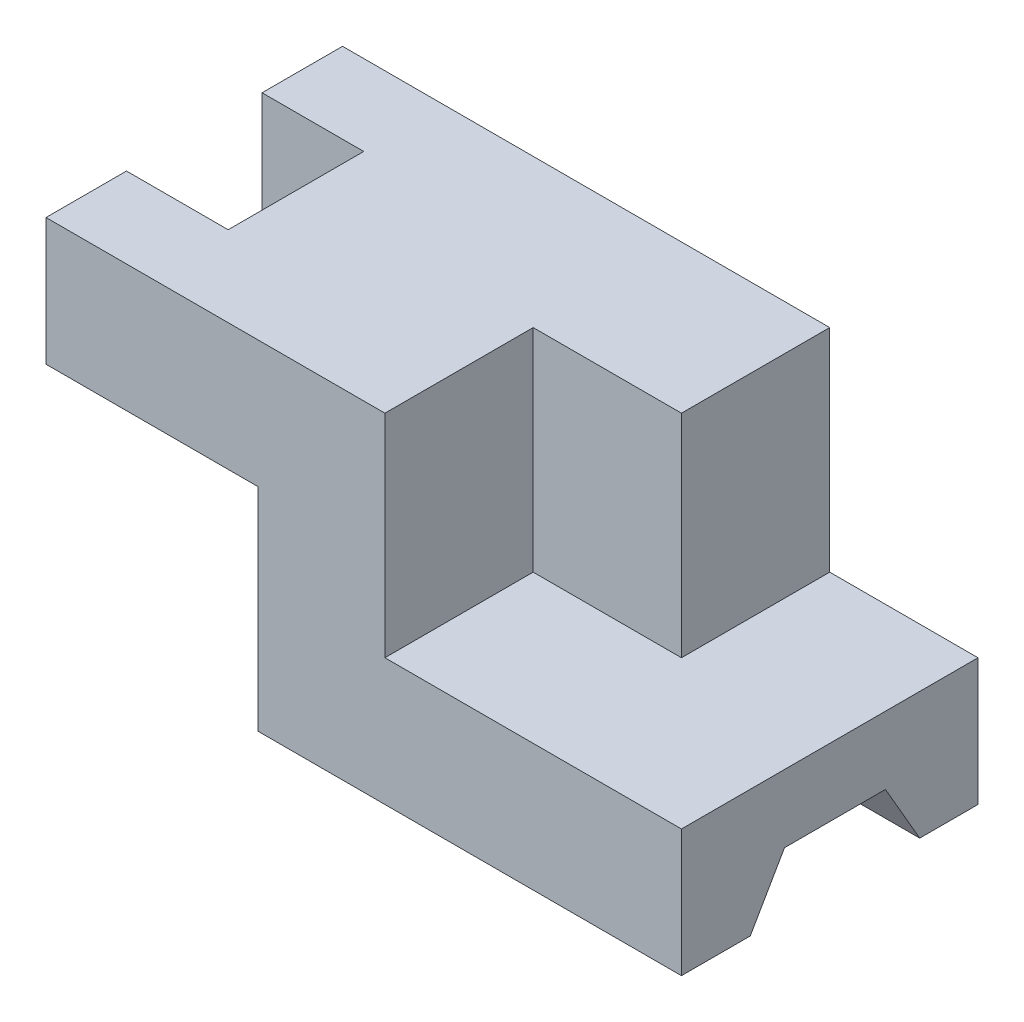
ISO-10303-21;
HEADER;
FILE_DESCRIPTION(('STEP AP214'),'2;1');
FILE_NAME('part.step','',(''),(''),'','','');
FILE_SCHEMA(('AUTOMOTIVE_DESIGN { 1 0 10303 214 1 1 1 1 }'));
ENDSEC;
DATA;
#1=APPLICATION_CONTEXT('core data for automotive mechanical design processes');
#2=APPLICATION_PROTOCOL_DEFINITION('international standard','automotive_design',2000,#1);
#3=PRODUCT_CONTEXT('',#1,'mechanical');
#4=PRODUCT('Part','Part','',(#3));
#5=PRODUCT_RELATED_PRODUCT_CATEGORY('part','',(#4));
#6=PRODUCT_DEFINITION_FORMATION('','',#4);
#7=PRODUCT_DEFINITION_CONTEXT('part definition',#1,'design');
#8=PRODUCT_DEFINITION('design','',#6,#7);
#9=PRODUCT_DEFINITION_SHAPE('','',#8);
#10=(LENGTH_UNIT() NAMED_UNIT(*) SI_UNIT(.MILLI.,.METRE.));
#11=(NAMED_UNIT(*) PLANE_ANGLE_UNIT() SI_UNIT($,.RADIAN.));
#12=(NAMED_UNIT(*) SI_UNIT($,.STERADIAN.) SOLID_ANGLE_UNIT());
#13=UNCERTAINTY_MEASURE_WITH_UNIT(LENGTH_MEASURE(1.E-05),#10,'distance_accuracy_value','');
#14=(GEOMETRIC_REPRESENTATION_CONTEXT(3) GLOBAL_UNCERTAINTY_ASSIGNED_CONTEXT((#13)) GLOBAL_UNIT_ASSIGNED_CONTEXT((#10,
#11,#12)) REPRESENTATION_CONTEXT('',''));
#15=CARTESIAN_POINT('',(0.,0.,0.));
#16=DIRECTION('',(0.,0.,1.));
#17=DIRECTION('',(1.,0.,0.));
#18=AXIS2_PLACEMENT_3D('',#15,#16,#17);
#19=CARTESIAN_POINT('',(25.,0.,35.));
#20=DIRECTION('',(-1.,0.,0.));
#21=DIRECTION('',(0.,0.,1.));
#22=AXIS2_PLACEMENT_3D('',#19,#20,#21);
#23=PLANE('',#22);
#24=DIRECTION('',(0.,0.,1.));
#25=VECTOR('',#24,1.);
#26=CARTESIAN_POINT('',(25.,7.,35.));
#27=LINE('',#26,#25);
#28=CARTESIAN_POINT('',(25.,7.,10.9203967015316));
#29=VERTEX_POINT('',#28);
#30=CARTESIAN_POINT('',(25.,7.,22.8374929328767));
#31=VERTEX_POINT('',#30);
#32=EDGE_CURVE('E347',#29,#31,#27,.T.);
#33=ORIENTED_EDGE('',*,*,#32,.T.);
#34=DIRECTION('',(0.,-0.866025403784436,0.500000000000004));
#35=VECTOR('',#34,1.);
#36=CARTESIAN_POINT('',(25.,-3.51652004691827,28.9092086129031));
#37=LINE('',#36,#35);
#38=CARTESIAN_POINT('',(25.,0.,26.8789448172041));
#39=VERTEX_POINT('',#38);
#40=EDGE_CURVE('E345',#31,#39,#37,.T.);
#41=ORIENTED_EDGE('',*,*,#40,.T.);
#42=DIRECTION('',(0.,0.,-1.));
#43=VECTOR('',#42,1.);
#44=CARTESIAN_POINT('',(25.,0.,35.));
#45=LINE('',#44,#43);
#46=CARTESIAN_POINT('',(25.,0.,35.));
#47=VERTEX_POINT('',#46);
#48=EDGE_CURVE('E185',#47,#39,#45,.T.);
#49=ORIENTED_EDGE('',*,*,#48,.F.);
#50=DIRECTION('',(0.,1.,0.));
#51=VECTOR('',#50,1.);
#52=CARTESIAN_POINT('',(25.,0.,35.));
#53=LINE('',#52,#51);
#54=CARTESIAN_POINT('',(25.,25.,35.));
#55=VERTEX_POINT('',#54);
#56=EDGE_CURVE('E276',#47,#55,#53,.T.);
#57=ORIENTED_EDGE('',*,*,#56,.T.);
#58=DIRECTION('',(0.,0.,-1.));
#59=VECTOR('',#58,1.);
#60=CARTESIAN_POINT('',(25.,25.,35.));
#61=LINE('',#60,#59);
#62=CARTESIAN_POINT('',(25.,25.,0.));
#63=VERTEX_POINT('',#62);
#64=EDGE_CURVE('E204',#55,#63,#61,.T.);
#65=ORIENTED_EDGE('',*,*,#64,.T.);
#66=DIRECTION('',(0.,1.,0.));
#67=VECTOR('',#66,1.);
#68=CARTESIAN_POINT('',(25.,0.,0.));
#69=LINE('',#68,#67);
#70=CARTESIAN_POINT('',(25.,0.,0.));
#71=VERTEX_POINT('',#70);
#72=EDGE_CURVE('E300',#71,#63,#69,.T.);
#73=ORIENTED_EDGE('',*,*,#72,.F.);
#74=CARTESIAN_POINT('',(25.,0.,6.87894481720414));
#75=VERTEX_POINT('',#74);
#76=EDGE_CURVE('E193',#75,#71,#45,.T.);
#77=ORIENTED_EDGE('',*,*,#76,.F.);
#78=DIRECTION('',(0.,0.866025403784436,0.500000000000004));
#79=VECTOR('',#78,1.);
#80=CARTESIAN_POINT('',(25.,12.1767740847627,13.9092086129032));
#81=LINE('',#80,#79);
#82=EDGE_CURVE('E187',#75,#29,#81,.T.);
#83=ORIENTED_EDGE('',*,*,#82,.T.);
#84=EDGE_LOOP('',(#33,#41,#49,#57,#65,#73,#77,#83));
#85=FACE_BOUND('',#84,.T.);
#86=ADVANCED_FACE('F39',(#85),#23,.T.);
#87=CARTESIAN_POINT('',(0.,0.,35.));
#88=DIRECTION('',(0.,1.,0.));
#89=DIRECTION('',(0.,0.,1.));
#90=AXIS2_PLACEMENT_3D('',#87,#88,#89);
#91=PLANE('',#90);
#92=DIRECTION('',(1.,0.,0.));
#93=VECTOR('',#92,1.);
#94=CARTESIAN_POINT('',(0.,0.,26.8789448172041));
#95=LINE('',#94,#93);
#96=CARTESIAN_POINT('',(75.,0.,26.8789448172041));
#97=VERTEX_POINT('',#96);
#98=EDGE_CURVE('E167',#39,#97,#95,.T.);
#99=ORIENTED_EDGE('',*,*,#98,.T.);
#100=DIRECTION('',(0.,0.,-1.));
#101=VECTOR('',#100,1.);
#102=CARTESIAN_POINT('',(75.,0.,35.));
#103=LINE('',#102,#101);
#104=CARTESIAN_POINT('',(75.,0.,35.));
#105=VERTEX_POINT('',#104);
#106=EDGE_CURVE('E183',#105,#97,#103,.T.);
#107=ORIENTED_EDGE('',*,*,#106,.F.);
#108=DIRECTION('',(1.,0.,0.));
#109=VECTOR('',#108,1.);
#110=CARTESIAN_POINT('',(0.,0.,35.));
#111=LINE('',#110,#109);
#112=EDGE_CURVE('E280',#47,#105,#111,.T.);
#113=ORIENTED_EDGE('',*,*,#112,.F.);
#114=ORIENTED_EDGE('',*,*,#48,.T.);
#115=EDGE_LOOP('',(#99,#107,#113,#114));
#116=FACE_BOUND('',#115,.T.);
#117=ADVANCED_FACE('F181',(#116),#91,.F.);
#118=DIRECTION('',(1.,0.,0.));
#119=VECTOR('',#118,1.);
#120=CARTESIAN_POINT('',(0.,0.,6.87894481720414));
#121=LINE('',#120,#119);
#122=CARTESIAN_POINT('',(75.,0.,6.87894481720414));
#123=VERTEX_POINT('',#122);
#124=EDGE_CURVE('E55',#75,#123,#121,.T.);
#125=ORIENTED_EDGE('',*,*,#124,.F.);
#126=ORIENTED_EDGE('',*,*,#76,.T.);
#127=DIRECTION('',(1.,0.,0.));
#128=VECTOR('',#127,1.);
#129=CARTESIAN_POINT('',(0.,0.,0.));
#130=LINE('',#129,#128);
#131=CARTESIAN_POINT('',(75.,0.,0.));
#132=VERTEX_POINT('',#131);
#133=EDGE_CURVE('E304',#71,#132,#130,.T.);
#134=ORIENTED_EDGE('',*,*,#133,.T.);
#135=EDGE_CURVE('E194',#123,#132,#103,.T.);
#136=ORIENTED_EDGE('',*,*,#135,.F.);
#137=EDGE_LOOP('',(#125,#126,#134,#136));
#138=FACE_BOUND('',#137,.T.);
#139=ADVANCED_FACE('F404',(#138),#91,.F.);
#140=CARTESIAN_POINT('',(75.,0.,35.));
#141=DIRECTION('',(-1.,0.,0.));
#142=DIRECTION('',(0.,0.,1.));
#143=AXIS2_PLACEMENT_3D('',#140,#141,#142);
#144=PLANE('',#143);
#145=DIRECTION('',(0.,0.866025403784436,-0.500000000000004));
#146=VECTOR('',#145,1.);
#147=CARTESIAN_POINT('',(75.,0.,26.8789448172041));
#148=LINE('',#147,#146);
#149=CARTESIAN_POINT('',(75.,7.,22.8374929328767));
#150=VERTEX_POINT('',#149);
#151=EDGE_CURVE('E164',#97,#150,#148,.T.);
#152=ORIENTED_EDGE('',*,*,#151,.T.);
#153=DIRECTION('',(0.,0.,-1.));
#154=VECTOR('',#153,1.);
#155=CARTESIAN_POINT('',(75.,7.,22.8374929328767));
#156=LINE('',#155,#154);
#157=CARTESIAN_POINT('',(75.,7.,10.9203967015316));
#158=VERTEX_POINT('',#157);
#159=EDGE_CURVE('E176',#150,#158,#156,.T.);
#160=ORIENTED_EDGE('',*,*,#159,.T.);
#161=DIRECTION('',(0.,-0.866025403784436,-0.500000000000004));
#162=VECTOR('',#161,1.);
#163=CARTESIAN_POINT('',(75.,7.,10.9203967015316));
#164=LINE('',#163,#162);
#165=EDGE_CURVE('E556',#158,#123,#164,.T.);
#166=ORIENTED_EDGE('',*,*,#165,.T.);
#167=ORIENTED_EDGE('',*,*,#135,.T.);
#168=DIRECTION('',(0.,1.,0.));
#169=VECTOR('',#168,1.);
#170=CARTESIAN_POINT('',(75.,0.,0.));
#171=LINE('',#170,#169);
#172=CARTESIAN_POINT('',(75.,15.,0.));
#173=VERTEX_POINT('',#172);
#174=EDGE_CURVE('E262',#132,#173,#171,.T.);
#175=ORIENTED_EDGE('',*,*,#174,.T.);
#176=DIRECTION('',(0.,0.,-1.));
#177=VECTOR('',#176,1.);
#178=CARTESIAN_POINT('',(75.,15.,35.));
#179=LINE('',#178,#177);
#180=CARTESIAN_POINT('',(75.,15.,35.));
#181=VERTEX_POINT('',#180);
#182=EDGE_CURVE('E199',#181,#173,#179,.T.);
#183=ORIENTED_EDGE('',*,*,#182,.F.);
#184=DIRECTION('',(0.,1.,0.));
#185=VECTOR('',#184,1.);
#186=CARTESIAN_POINT('',(75.,0.,35.));
#187=LINE('',#186,#185);
#188=EDGE_CURVE('E191',#105,#181,#187,.T.);
#189=ORIENTED_EDGE('',*,*,#188,.F.);
#190=ORIENTED_EDGE('',*,*,#106,.T.);
#191=EDGE_LOOP('',(#152,#160,#166,#167,#175,#183,#189,#190));
#192=FACE_BOUND('',#191,.T.);
#193=ADVANCED_FACE('F189',(#192),#144,.F.);
#194=CARTESIAN_POINT('',(0.,40.,35.));
#195=DIRECTION('',(0.,1.,0.));
#196=DIRECTION('',(0.,0.,1.));
#197=AXIS2_PLACEMENT_3D('',#194,#195,#196);
#198=PLANE('',#197);
#199=DIRECTION('',(0.,0.,-1.));
#200=VECTOR('',#199,1.);
#201=CARTESIAN_POINT('',(0.,40.,35.));
#202=LINE('',#201,#200);
#203=CARTESIAN_POINT('',(0.,40.,9.5));
#204=VERTEX_POINT('',#203);
#205=CARTESIAN_POINT('',(0.,40.,0.));
#206=VERTEX_POINT('',#205);
#207=EDGE_CURVE('E212',#204,#206,#202,.T.);
#208=ORIENTED_EDGE('',*,*,#207,.F.);
#209=DIRECTION('',(1.,0.,0.));
#210=VECTOR('',#209,1.);
#211=CARTESIAN_POINT('',(0.,40.,9.5));
#212=LINE('',#211,#210);
#213=CARTESIAN_POINT('',(12.,40.,9.5));
#214=VERTEX_POINT('',#213);
#215=EDGE_CURVE('E247',#204,#214,#212,.T.);
#216=ORIENTED_EDGE('',*,*,#215,.T.);
#217=DIRECTION('',(0.,0.,1.));
#218=VECTOR('',#217,1.);
#219=CARTESIAN_POINT('',(12.,40.,9.5));
#220=LINE('',#219,#218);
#221=CARTESIAN_POINT('',(12.,40.,25.5));
#222=VERTEX_POINT('',#221);
#223=EDGE_CURVE('E253',#214,#222,#220,.T.);
#224=ORIENTED_EDGE('',*,*,#223,.T.);
#225=DIRECTION('',(1.,0.,0.));
#226=VECTOR('',#225,1.);
#227=CARTESIAN_POINT('',(0.,40.,25.5));
#228=LINE('',#227,#226);
#229=CARTESIAN_POINT('',(0.,40.,25.5));
#230=VERTEX_POINT('',#229);
#231=EDGE_CURVE('E370',#230,#222,#228,.T.);
#232=ORIENTED_EDGE('',*,*,#231,.F.);
#233=CARTESIAN_POINT('',(0.,40.,35.));
#234=VERTEX_POINT('',#233);
#235=EDGE_CURVE('E213',#234,#230,#202,.T.);
#236=ORIENTED_EDGE('',*,*,#235,.F.);
#237=DIRECTION('',(1.,0.,0.));
#238=VECTOR('',#237,1.);
#239=CARTESIAN_POINT('',(0.,40.,35.));
#240=LINE('',#239,#238);
#241=CARTESIAN_POINT('',(40.,40.,35.));
#242=VERTEX_POINT('',#241);
#243=EDGE_CURVE('E266',#234,#242,#240,.T.);
#244=ORIENTED_EDGE('',*,*,#243,.T.);
#245=DIRECTION('',(0.,0.,-1.));
#246=VECTOR('',#245,1.);
#247=CARTESIAN_POINT('',(40.,40.,35.));
#248=LINE('',#247,#246);
#249=CARTESIAN_POINT('',(40.,40.,17.5));
#250=VERTEX_POINT('',#249);
#251=EDGE_CURVE('E217',#242,#250,#248,.T.);
#252=ORIENTED_EDGE('',*,*,#251,.T.);
#253=DIRECTION('',(1.,0.,0.));
#254=VECTOR('',#253,1.);
#255=CARTESIAN_POINT('',(40.,40.,17.5));
#256=LINE('',#255,#254);
#257=CARTESIAN_POINT('',(57.5,40.,17.5));
#258=VERTEX_POINT('',#257);
#259=EDGE_CURVE('E338',#250,#258,#256,.T.);
#260=ORIENTED_EDGE('',*,*,#259,.T.);
#261=DIRECTION('',(0.,0.,-1.));
#262=VECTOR('',#261,1.);
#263=CARTESIAN_POINT('',(57.5,40.,0.));
#264=LINE('',#263,#262);
#265=CARTESIAN_POINT('',(57.5,40.,0.));
#266=VERTEX_POINT('',#265);
#267=EDGE_CURVE('E352',#258,#266,#264,.T.);
#268=ORIENTED_EDGE('',*,*,#267,.T.);
#269=DIRECTION('',(1.,0.,0.));
#270=VECTOR('',#269,1.);
#271=CARTESIAN_POINT('',(0.,40.,0.));
#272=LINE('',#271,#270);
#273=EDGE_CURVE('E288',#206,#266,#272,.T.);
#274=ORIENTED_EDGE('',*,*,#273,.F.);
#275=EDGE_LOOP('',(#208,#216,#224,#232,#236,#244,#252,#260,#268,#274));
#276=FACE_BOUND('',#275,.T.);
#277=ADVANCED_FACE('F336',(#276),#198,.T.);
#278=CARTESIAN_POINT('',(0.,0.,35.));
#279=DIRECTION('',(-1.,0.,0.));
#280=DIRECTION('',(0.,0.,1.));
#281=AXIS2_PLACEMENT_3D('',#278,#279,#280);
#282=PLANE('',#281);
#283=DIRECTION('',(0.,0.,-1.));
#284=VECTOR('',#283,1.);
#285=CARTESIAN_POINT('',(0.,25.,35.));
#286=LINE('',#285,#284);
#287=CARTESIAN_POINT('',(0.,25.,9.5));
#288=VERTEX_POINT('',#287);
#289=CARTESIAN_POINT('',(0.,25.,0.));
#290=VERTEX_POINT('',#289);
#291=EDGE_CURVE('E207',#288,#290,#286,.T.);
#292=ORIENTED_EDGE('',*,*,#291,.F.);
#293=DIRECTION('',(0.,1.,0.));
#294=VECTOR('',#293,1.);
#295=CARTESIAN_POINT('',(0.,5.,9.5));
#296=LINE('',#295,#294);
#297=EDGE_CURVE('E289',#288,#204,#296,.T.);
#298=ORIENTED_EDGE('',*,*,#297,.T.);
#299=ORIENTED_EDGE('',*,*,#207,.T.);
#300=DIRECTION('',(0.,1.,0.));
#301=VECTOR('',#300,1.);
#302=CARTESIAN_POINT('',(0.,0.,0.));
#303=LINE('',#302,#301);
#304=EDGE_CURVE('E292',#290,#206,#303,.T.);
#305=ORIENTED_EDGE('',*,*,#304,.F.);
#306=EDGE_LOOP('',(#292,#298,#299,#305));
#307=FACE_BOUND('',#306,.T.);
#308=ADVANCED_FACE('F389',(#307),#282,.T.);
#309=CARTESIAN_POINT('',(0.,25.,35.));
#310=DIRECTION('',(0.,1.,0.));
#311=DIRECTION('',(-1.,0.,0.));
#312=AXIS2_PLACEMENT_3D('',#309,#310,#311);
#313=PLANE('',#312);
#314=DIRECTION('',(1.,0.,0.));
#315=VECTOR('',#314,1.);
#316=CARTESIAN_POINT('',(0.,25.,9.5));
#317=LINE('',#316,#315);
#318=CARTESIAN_POINT('',(12.,25.,9.5));
#319=VERTEX_POINT('',#318);
#320=EDGE_CURVE('E11',#288,#319,#317,.T.);
#321=ORIENTED_EDGE('',*,*,#320,.F.);
#322=ORIENTED_EDGE('',*,*,#291,.T.);
#323=DIRECTION('',(1.,0.,0.));
#324=VECTOR('',#323,1.);
#325=CARTESIAN_POINT('',(0.,25.,0.));
#326=LINE('',#325,#324);
#327=EDGE_CURVE('E296',#290,#63,#326,.T.);
#328=ORIENTED_EDGE('',*,*,#327,.T.);
#329=ORIENTED_EDGE('',*,*,#64,.F.);
#330=DIRECTION('',(1.,0.,0.));
#331=VECTOR('',#330,1.);
#332=CARTESIAN_POINT('',(0.,25.,35.));
#333=LINE('',#332,#331);
#334=CARTESIAN_POINT('',(0.,25.,35.));
#335=VERTEX_POINT('',#334);
#336=EDGE_CURVE('E273',#335,#55,#333,.T.);
#337=ORIENTED_EDGE('',*,*,#336,.F.);
#338=CARTESIAN_POINT('',(0.,25.,25.5));
#339=VERTEX_POINT('',#338);
#340=EDGE_CURVE('E208',#335,#339,#286,.T.);
#341=ORIENTED_EDGE('',*,*,#340,.T.);
#342=DIRECTION('',(1.,0.,0.));
#343=VECTOR('',#342,1.);
#344=CARTESIAN_POINT('',(0.,25.,25.5));
#345=LINE('',#344,#343);
#346=CARTESIAN_POINT('',(12.,25.,25.5));
#347=VERTEX_POINT('',#346);
#348=EDGE_CURVE('E225',#339,#347,#345,.T.);
#349=ORIENTED_EDGE('',*,*,#348,.T.);
#350=DIRECTION('',(0.,0.,1.));
#351=VECTOR('',#350,1.);
#352=CARTESIAN_POINT('',(12.,25.,35.));
#353=LINE('',#352,#351);
#354=EDGE_CURVE('E48',#319,#347,#353,.T.);
#355=ORIENTED_EDGE('',*,*,#354,.F.);
#356=EDGE_LOOP('',(#321,#322,#328,#329,#337,#341,#349,#355));
#357=FACE_BOUND('',#356,.T.);
#358=ADVANCED_FACE('F237',(#357),#313,.F.);
#359=CARTESIAN_POINT('',(0.,15.,35.));
#360=DIRECTION('',(0.,1.,0.));
#361=DIRECTION('',(0.,0.,1.));
#362=AXIS2_PLACEMENT_3D('',#359,#360,#361);
#363=PLANE('',#362);
#364=DIRECTION('',(0.,0.,1.));
#365=VECTOR('',#364,1.);
#366=CARTESIAN_POINT('',(57.5,15.,0.));
#367=LINE('',#366,#365);
#368=CARTESIAN_POINT('',(57.5,15.,0.));
#369=VERTEX_POINT('',#368);
#370=CARTESIAN_POINT('',(57.5,15.,17.5));
#371=VERTEX_POINT('',#370);
#372=EDGE_CURVE('E367',#369,#371,#367,.T.);
#373=ORIENTED_EDGE('',*,*,#372,.T.);
#374=DIRECTION('',(-1.,0.,0.));
#375=VECTOR('',#374,1.);
#376=CARTESIAN_POINT('',(40.,15.,17.5));
#377=LINE('',#376,#375);
#378=CARTESIAN_POINT('',(40.,15.,17.5));
#379=VERTEX_POINT('',#378);
#380=EDGE_CURVE('E361',#371,#379,#377,.T.);
#381=ORIENTED_EDGE('',*,*,#380,.T.);
#382=DIRECTION('',(0.,0.,-1.));
#383=VECTOR('',#382,1.);
#384=CARTESIAN_POINT('',(40.,15.,35.));
#385=LINE('',#384,#383);
#386=CARTESIAN_POINT('',(40.,15.,35.));
#387=VERTEX_POINT('',#386);
#388=EDGE_CURVE('E221',#387,#379,#385,.T.);
#389=ORIENTED_EDGE('',*,*,#388,.F.);
#390=DIRECTION('',(1.,0.,0.));
#391=VECTOR('',#390,1.);
#392=CARTESIAN_POINT('',(0.,15.,35.));
#393=LINE('',#392,#391);
#394=EDGE_CURVE('E257',#387,#181,#393,.T.);
#395=ORIENTED_EDGE('',*,*,#394,.T.);
#396=ORIENTED_EDGE('',*,*,#182,.T.);
#397=DIRECTION('',(1.,0.,0.));
#398=VECTOR('',#397,1.);
#399=CARTESIAN_POINT('',(0.,15.,0.));
#400=LINE('',#399,#398);
#401=EDGE_CURVE('E285',#369,#173,#400,.T.);
#402=ORIENTED_EDGE('',*,*,#401,.F.);
#403=EDGE_LOOP('',(#373,#381,#389,#395,#396,#402));
#404=FACE_BOUND('',#403,.T.);
#405=ADVANCED_FACE('F41',(#404),#363,.T.);
#406=CARTESIAN_POINT('',(40.,0.,35.));
#407=DIRECTION('',(1.,0.,0.));
#408=DIRECTION('',(0.,1.,0.));
#409=AXIS2_PLACEMENT_3D('',#406,#407,#408);
#410=PLANE('',#409);
#411=DIRECTION('',(0.,1.,0.));
#412=VECTOR('',#411,1.);
#413=CARTESIAN_POINT('',(40.,-0.002000000000002,17.5));
#414=LINE('',#413,#412);
#415=EDGE_CURVE('E332',#379,#250,#414,.T.);
#416=ORIENTED_EDGE('',*,*,#415,.T.);
#417=ORIENTED_EDGE('',*,*,#251,.F.);
#418=DIRECTION('',(0.,-1.,0.));
#419=VECTOR('',#418,1.);
#420=CARTESIAN_POINT('',(40.,0.,35.));
#421=LINE('',#420,#419);
#422=EDGE_CURVE('E261',#242,#387,#421,.T.);
#423=ORIENTED_EDGE('',*,*,#422,.T.);
#424=ORIENTED_EDGE('',*,*,#388,.T.);
#425=EDGE_LOOP('',(#416,#417,#423,#424));
#426=FACE_BOUND('',#425,.T.);
#427=ADVANCED_FACE('F331',(#426),#410,.T.);
#428=DIRECTION('',(0.,1.,0.));
#429=VECTOR('',#428,1.);
#430=CARTESIAN_POINT('',(0.,5.,25.5));
#431=LINE('',#430,#429);
#432=EDGE_CURVE('E241',#339,#230,#431,.T.);
#433=ORIENTED_EDGE('',*,*,#432,.F.);
#434=ORIENTED_EDGE('',*,*,#340,.F.);
#435=DIRECTION('',(0.,1.,0.));
#436=VECTOR('',#435,1.);
#437=CARTESIAN_POINT('',(0.,0.,35.));
#438=LINE('',#437,#436);
#439=EDGE_CURVE('E270',#335,#234,#438,.T.);
#440=ORIENTED_EDGE('',*,*,#439,.T.);
#441=ORIENTED_EDGE('',*,*,#235,.T.);
#442=EDGE_LOOP('',(#433,#434,#440,#441));
#443=FACE_BOUND('',#442,.T.);
#444=ADVANCED_FACE('F244',(#443),#282,.T.);
#445=CARTESIAN_POINT('',(0.,0.,35.));
#446=DIRECTION('',(0.,0.,1.));
#447=DIRECTION('',(1.,0.,0.));
#448=AXIS2_PLACEMENT_3D('',#445,#446,#447);
#449=PLANE('',#448);
#450=ORIENTED_EDGE('',*,*,#394,.F.);
#451=ORIENTED_EDGE('',*,*,#422,.F.);
#452=ORIENTED_EDGE('',*,*,#243,.F.);
#453=ORIENTED_EDGE('',*,*,#439,.F.);
#454=ORIENTED_EDGE('',*,*,#336,.T.);
#455=ORIENTED_EDGE('',*,*,#56,.F.);
#456=ORIENTED_EDGE('',*,*,#112,.T.);
#457=ORIENTED_EDGE('',*,*,#188,.T.);
#458=EDGE_LOOP('',(#450,#451,#452,#453,#454,#455,#456,#457));
#459=FACE_BOUND('',#458,.T.);
#460=ADVANCED_FACE('F327',(#459),#449,.T.);
#461=CARTESIAN_POINT('',(0.,0.,0.));
#462=DIRECTION('',(0.,0.,1.));
#463=DIRECTION('',(1.,0.,0.));
#464=AXIS2_PLACEMENT_3D('',#461,#462,#463);
#465=PLANE('',#464);
#466=DIRECTION('',(0.,1.,0.));
#467=VECTOR('',#466,1.);
#468=CARTESIAN_POINT('',(57.5,-0.002000000000002,0.));
#469=LINE('',#468,#467);
#470=EDGE_CURVE('E319',#369,#266,#469,.T.);
#471=ORIENTED_EDGE('',*,*,#470,.F.);
#472=ORIENTED_EDGE('',*,*,#401,.T.);
#473=ORIENTED_EDGE('',*,*,#174,.F.);
#474=ORIENTED_EDGE('',*,*,#133,.F.);
#475=ORIENTED_EDGE('',*,*,#72,.T.);
#476=ORIENTED_EDGE('',*,*,#327,.F.);
#477=ORIENTED_EDGE('',*,*,#304,.T.);
#478=ORIENTED_EDGE('',*,*,#273,.T.);
#479=EDGE_LOOP('',(#471,#472,#473,#474,#475,#476,#477,#478));
#480=FACE_BOUND('',#479,.T.);
#481=ADVANCED_FACE('F315',(#480),#465,.F.);
#482=CARTESIAN_POINT('',(0.,5.,9.5));
#483=DIRECTION('',(0.,0.,1.));
#484=DIRECTION('',(1.,0.,0.));
#485=AXIS2_PLACEMENT_3D('',#482,#483,#484);
#486=PLANE('',#485);
#487=ORIENTED_EDGE('',*,*,#320,.T.);
#488=DIRECTION('',(0.,1.,0.));
#489=VECTOR('',#488,1.);
#490=CARTESIAN_POINT('',(12.,5.,9.5));
#491=LINE('',#490,#489);
#492=EDGE_CURVE('E234',#319,#214,#491,.T.);
#493=ORIENTED_EDGE('',*,*,#492,.T.);
#494=ORIENTED_EDGE('',*,*,#215,.F.);
#495=ORIENTED_EDGE('',*,*,#297,.F.);
#496=EDGE_LOOP('',(#487,#493,#494,#495));
#497=FACE_BOUND('',#496,.T.);
#498=ADVANCED_FACE('F382',(#497),#486,.T.);
#499=CARTESIAN_POINT('',(12.,5.,9.5));
#500=DIRECTION('',(-1.,0.,0.));
#501=DIRECTION('',(0.,0.,1.));
#502=AXIS2_PLACEMENT_3D('',#499,#500,#501);
#503=PLANE('',#502);
#504=ORIENTED_EDGE('',*,*,#354,.T.);
#505=DIRECTION('',(0.,1.,0.));
#506=VECTOR('',#505,1.);
#507=CARTESIAN_POINT('',(12.,5.,25.5));
#508=LINE('',#507,#506);
#509=EDGE_CURVE('E63',#347,#222,#508,.T.);
#510=ORIENTED_EDGE('',*,*,#509,.T.);
#511=ORIENTED_EDGE('',*,*,#223,.F.);
#512=ORIENTED_EDGE('',*,*,#492,.F.);
#513=EDGE_LOOP('',(#504,#510,#511,#512));
#514=FACE_BOUND('',#513,.T.);
#515=ADVANCED_FACE('F232',(#514),#503,.T.);
#516=CARTESIAN_POINT('',(0.,5.,25.5));
#517=DIRECTION('',(0.,0.,1.));
#518=DIRECTION('',(1.,0.,0.));
#519=AXIS2_PLACEMENT_3D('',#516,#517,#518);
#520=PLANE('',#519);
#521=ORIENTED_EDGE('',*,*,#432,.T.);
#522=ORIENTED_EDGE('',*,*,#231,.T.);
#523=ORIENTED_EDGE('',*,*,#509,.F.);
#524=ORIENTED_EDGE('',*,*,#348,.F.);
#525=EDGE_LOOP('',(#521,#522,#523,#524));
#526=FACE_BOUND('',#525,.T.);
#527=ADVANCED_FACE('F240',(#526),#520,.F.);
#528=CARTESIAN_POINT('',(57.5,-0.002000000000002,0.));
#529=DIRECTION('',(1.,0.,0.));
#530=DIRECTION('',(0.,0.,-1.));
#531=AXIS2_PLACEMENT_3D('',#528,#529,#530);
#532=PLANE('',#531);
#533=ORIENTED_EDGE('',*,*,#372,.F.);
#534=ORIENTED_EDGE('',*,*,#470,.T.);
#535=ORIENTED_EDGE('',*,*,#267,.F.);
#536=DIRECTION('',(0.,1.,0.));
#537=VECTOR('',#536,1.);
#538=CARTESIAN_POINT('',(57.5,-0.002000000000002,17.5));
#539=LINE('',#538,#537);
#540=EDGE_CURVE('E362',#371,#258,#539,.T.);
#541=ORIENTED_EDGE('',*,*,#540,.F.);
#542=EDGE_LOOP('',(#533,#534,#535,#541));
#543=FACE_BOUND('',#542,.T.);
#544=ADVANCED_FACE('F415',(#543),#532,.T.);
#545=CARTESIAN_POINT('',(40.,-0.002000000000002,17.5));
#546=DIRECTION('',(0.,0.,1.));
#547=DIRECTION('',(1.,0.,0.));
#548=AXIS2_PLACEMENT_3D('',#545,#546,#547);
#549=PLANE('',#548);
#550=ORIENTED_EDGE('',*,*,#380,.F.);
#551=ORIENTED_EDGE('',*,*,#540,.T.);
#552=ORIENTED_EDGE('',*,*,#259,.F.);
#553=ORIENTED_EDGE('',*,*,#415,.F.);
#554=EDGE_LOOP('',(#550,#551,#552,#553));
#555=FACE_BOUND('',#554,.T.);
#556=ADVANCED_FACE('F416',(#555),#549,.T.);
#557=CARTESIAN_POINT('',(0.,0.,26.8789448172041));
#558=DIRECTION('',(0.,-0.500000000000004,-0.866025403784436));
#559=DIRECTION('',(0.,0.866025403784436,-0.500000000000004));
#560=AXIS2_PLACEMENT_3D('',#557,#558,#559);
#561=PLANE('',#560);
#562=DIRECTION('',(1.,0.,0.));
#563=VECTOR('',#562,1.);
#564=CARTESIAN_POINT('',(0.,7.,22.8374929328767));
#565=LINE('',#564,#563);
#566=EDGE_CURVE('E170',#31,#150,#565,.T.);
#567=ORIENTED_EDGE('',*,*,#566,.T.);
#568=ORIENTED_EDGE('',*,*,#151,.F.);
#569=ORIENTED_EDGE('',*,*,#98,.F.);
#570=ORIENTED_EDGE('',*,*,#40,.F.);
#571=EDGE_LOOP('',(#567,#568,#569,#570));
#572=FACE_BOUND('',#571,.T.);
#573=ADVANCED_FACE('F166',(#572),#561,.T.);
#574=CARTESIAN_POINT('',(0.,7.,22.8374929328767));
#575=DIRECTION('',(0.,-1.,0.));
#576=DIRECTION('',(0.,0.,-1.));
#577=AXIS2_PLACEMENT_3D('',#574,#575,#576);
#578=PLANE('',#577);
#579=DIRECTION('',(1.,0.,0.));
#580=VECTOR('',#579,1.);
#581=CARTESIAN_POINT('',(0.,7.,10.9203967015316));
#582=LINE('',#581,#580);
#583=EDGE_CURVE('E555',#29,#158,#582,.T.);
#584=ORIENTED_EDGE('',*,*,#583,.T.);
#585=ORIENTED_EDGE('',*,*,#159,.F.);
#586=ORIENTED_EDGE('',*,*,#566,.F.);
#587=ORIENTED_EDGE('',*,*,#32,.F.);
#588=EDGE_LOOP('',(#584,#585,#586,#587));
#589=FACE_BOUND('',#588,.T.);
#590=ADVANCED_FACE('F429',(#589),#578,.T.);
#591=CARTESIAN_POINT('',(0.,7.,10.9203967015316));
#592=DIRECTION('',(0.,-0.500000000000004,0.866025403784436));
#593=DIRECTION('',(0.,-0.866025403784436,-0.500000000000004));
#594=AXIS2_PLACEMENT_3D('',#591,#592,#593);
#595=PLANE('',#594);
#596=ORIENTED_EDGE('',*,*,#124,.T.);
#597=ORIENTED_EDGE('',*,*,#165,.F.);
#598=ORIENTED_EDGE('',*,*,#583,.F.);
#599=ORIENTED_EDGE('',*,*,#82,.F.);
#600=EDGE_LOOP('',(#596,#597,#598,#599));
#601=FACE_BOUND('',#600,.T.);
#602=ADVANCED_FACE('F432',(#601),#595,.T.);
#603=CLOSED_SHELL('',(#86,#117,#139,#193,#277,#308,#358,#405,#427,#444,#460,#481,#498,#515,#527,
#544,#556,#573,#590,#602));
#604=MANIFOLD_SOLID_BREP('B2',#603);
#605=ADVANCED_BREP_SHAPE_REPRESENTATION('',(#18,#604),#14);
#606=SHAPE_DEFINITION_REPRESENTATION(#9,#605);
ENDSEC;
END-ISO-10303-21;
